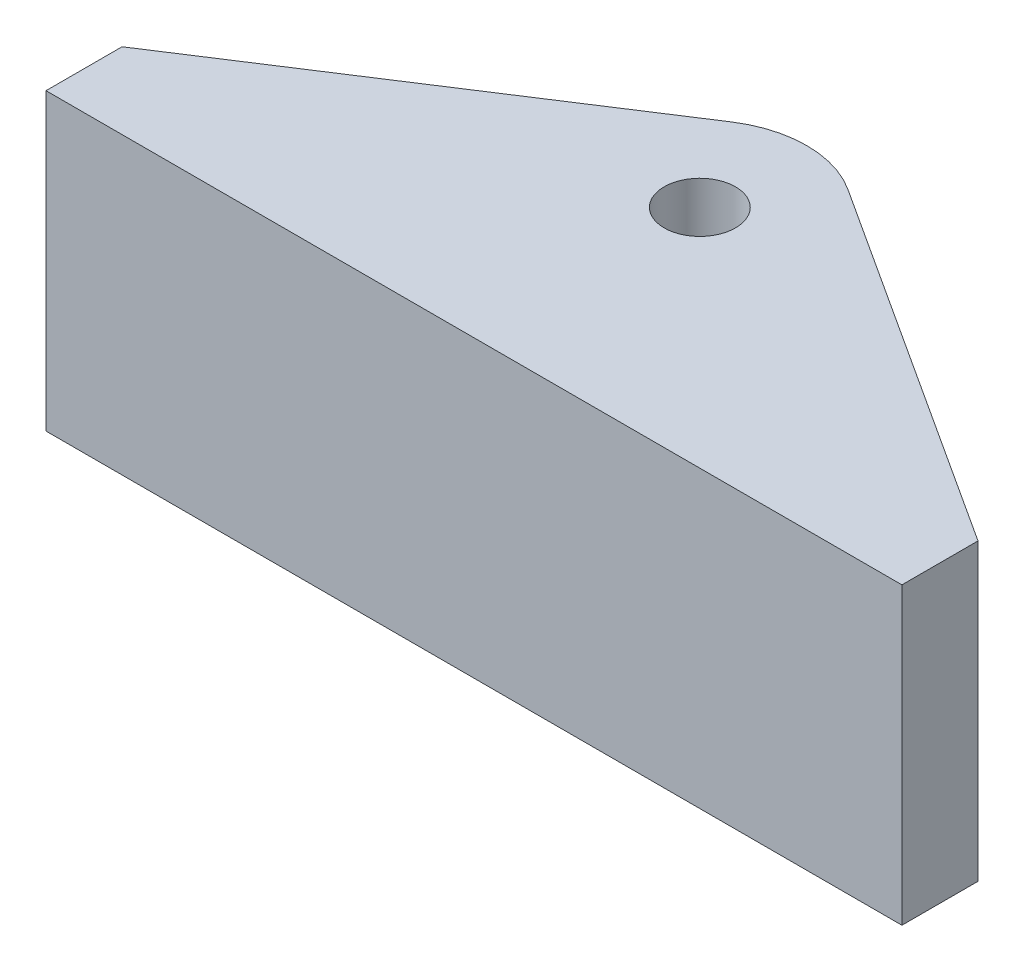
ISO-10303-21;
HEADER;
FILE_DESCRIPTION(('STEP AP214'),'2;1');
FILE_NAME('part.step','',(''),(''),'','','');
FILE_SCHEMA(('AUTOMOTIVE_DESIGN { 1 0 10303 214 1 1 1 1 }'));
ENDSEC;
DATA;
#1=APPLICATION_CONTEXT('core data for automotive mechanical design processes');
#2=APPLICATION_PROTOCOL_DEFINITION('international standard','automotive_design',2000,#1);
#3=PRODUCT_CONTEXT('',#1,'mechanical');
#4=PRODUCT('Part','Part','',(#3));
#5=PRODUCT_RELATED_PRODUCT_CATEGORY('part','',(#4));
#6=PRODUCT_DEFINITION_FORMATION('','',#4);
#7=PRODUCT_DEFINITION_CONTEXT('part definition',#1,'design');
#8=PRODUCT_DEFINITION('design','',#6,#7);
#9=PRODUCT_DEFINITION_SHAPE('','',#8);
#10=(LENGTH_UNIT() NAMED_UNIT(*) SI_UNIT(.MILLI.,.METRE.));
#11=(NAMED_UNIT(*) PLANE_ANGLE_UNIT() SI_UNIT($,.RADIAN.));
#12=(NAMED_UNIT(*) SI_UNIT($,.STERADIAN.) SOLID_ANGLE_UNIT());
#13=UNCERTAINTY_MEASURE_WITH_UNIT(LENGTH_MEASURE(1.E-05),#10,'distance_accuracy_value','');
#14=(GEOMETRIC_REPRESENTATION_CONTEXT(3) GLOBAL_UNCERTAINTY_ASSIGNED_CONTEXT((#13)) GLOBAL_UNIT_ASSIGNED_CONTEXT((#10,
#11,#12)) REPRESENTATION_CONTEXT('',''));
#15=CARTESIAN_POINT('',(0.,0.,0.));
#16=DIRECTION('',(0.,0.,1.));
#17=DIRECTION('',(1.,0.,0.));
#18=AXIS2_PLACEMENT_3D('',#15,#16,#17);
#19=CARTESIAN_POINT('',(0.,-19.685,0.));
#20=DIRECTION('',(-1.,0.,0.));
#21=DIRECTION('',(0.,0.,1.));
#22=AXIS2_PLACEMENT_3D('',#19,#20,#21);
#23=PLANE('',#22);
#24=DIRECTION('',(0.,0.,1.));
#25=VECTOR('',#24,1.);
#26=CARTESIAN_POINT('',(0.,0.,0.));
#27=LINE('',#26,#25);
#28=CARTESIAN_POINT('',(0.,0.,-5.08));
#29=VERTEX_POINT('',#28);
#30=CARTESIAN_POINT('',(0.,0.,0.));
#31=VERTEX_POINT('',#30);
#32=EDGE_CURVE('E136',#29,#31,#27,.T.);
#33=ORIENTED_EDGE('',*,*,#32,.F.);
#34=DIRECTION('',(0.,1.,0.));
#35=VECTOR('',#34,1.);
#36=CARTESIAN_POINT('',(0.,-19.685,-5.08));
#37=LINE('',#36,#35);
#38=CARTESIAN_POINT('',(0.,-19.685,-5.08));
#39=VERTEX_POINT('',#38);
#40=EDGE_CURVE('E11',#39,#29,#37,.T.);
#41=ORIENTED_EDGE('',*,*,#40,.F.);
#42=DIRECTION('',(0.,0.,1.));
#43=VECTOR('',#42,1.);
#44=CARTESIAN_POINT('',(0.,-19.685,0.));
#45=LINE('',#44,#43);
#46=CARTESIAN_POINT('',(0.,-19.685,0.));
#47=VERTEX_POINT('',#46);
#48=EDGE_CURVE('E157',#39,#47,#45,.T.);
#49=ORIENTED_EDGE('',*,*,#48,.T.);
#50=DIRECTION('',(0.,1.,0.));
#51=VECTOR('',#50,1.);
#52=CARTESIAN_POINT('',(0.,-19.685,0.));
#53=LINE('',#52,#51);
#54=EDGE_CURVE('E48',#47,#31,#53,.T.);
#55=ORIENTED_EDGE('',*,*,#54,.T.);
#56=EDGE_LOOP('',(#33,#41,#49,#55));
#57=FACE_BOUND('',#56,.T.);
#58=ADVANCED_FACE('F45',(#57),#23,.T.);
#59=CARTESIAN_POINT('',(0.,-19.685,-5.08));
#60=DIRECTION('',(-0.543739024440574,0.,-0.839254355544499));
#61=DIRECTION('',(-0.839254355544499,0.,0.543739024440574));
#62=AXIS2_PLACEMENT_3D('',#59,#60,#61);
#63=PLANE('',#62);
#64=DIRECTION('',(-0.839254355544499,0.,0.543739024440574));
#65=VECTOR('',#64,1.);
#66=CARTESIAN_POINT('',(0.,0.,-5.08));
#67=LINE('',#66,#65);
#68=CARTESIAN_POINT('',(24.6906643441527,0.,-21.076673302421));
#69=VERTEX_POINT('',#68);
#70=EDGE_CURVE('E154',#69,#29,#67,.T.);
#71=ORIENTED_EDGE('',*,*,#70,.F.);
#72=DIRECTION('',(0.,1.,0.));
#73=VECTOR('',#72,1.);
#74=CARTESIAN_POINT('',(24.6906643441527,-19.685,-21.076673302421));
#75=LINE('',#74,#73);
#76=CARTESIAN_POINT('',(24.6906643441527,-19.685,-21.076673302421));
#77=VERTEX_POINT('',#76);
#78=EDGE_CURVE('E55',#77,#69,#75,.T.);
#79=ORIENTED_EDGE('',*,*,#78,.F.);
#80=DIRECTION('',(-0.839254355544499,0.,0.543739024440574));
#81=VECTOR('',#80,1.);
#82=CARTESIAN_POINT('',(0.,-19.685,-5.08));
#83=LINE('',#82,#81);
#84=EDGE_CURVE('E122',#77,#39,#83,.T.);
#85=ORIENTED_EDGE('',*,*,#84,.T.);
#86=ORIENTED_EDGE('',*,*,#40,.T.);
#87=EDGE_LOOP('',(#71,#79,#85,#86));
#88=FACE_BOUND('',#87,.T.);
#89=ADVANCED_FACE('F169',(#88),#63,.T.);
#90=CARTESIAN_POINT('',(28.575,-19.685,-15.08125));
#91=DIRECTION('',(0.,1.,0.));
#92=DIRECTION('',(0.,0.,1.));
#93=AXIS2_PLACEMENT_3D('',#90,#91,#92);
#94=CYLINDRICAL_SURFACE('',#93,7.14375);
#95=CARTESIAN_POINT('',(28.575,0.,-15.08125));
#96=DIRECTION('',(0.,1.,0.));
#97=DIRECTION('',(0.,0.,1.));
#98=AXIS2_PLACEMENT_3D('',#95,#96,#97);
#99=CIRCLE('',#98,7.14375);
#100=CARTESIAN_POINT('',(32.4593356558474,0.,-21.076673302421));
#101=VERTEX_POINT('',#100);
#102=EDGE_CURVE('E108',#101,#69,#99,.T.);
#103=ORIENTED_EDGE('',*,*,#102,.F.);
#104=DIRECTION('',(0.,1.,0.));
#105=VECTOR('',#104,1.);
#106=CARTESIAN_POINT('',(32.4593356558474,-19.685,-21.076673302421));
#107=LINE('',#106,#105);
#108=CARTESIAN_POINT('',(32.4593356558474,-19.685,-21.076673302421));
#109=VERTEX_POINT('',#108);
#110=EDGE_CURVE('E103',#109,#101,#107,.T.);
#111=ORIENTED_EDGE('',*,*,#110,.F.);
#112=CARTESIAN_POINT('',(28.575,-19.685,-15.08125));
#113=DIRECTION('',(0.,1.,0.));
#114=DIRECTION('',(0.,0.,1.));
#115=AXIS2_PLACEMENT_3D('',#112,#113,#114);
#116=CIRCLE('',#115,7.14375);
#117=EDGE_CURVE('E106',#109,#77,#116,.T.);
#118=ORIENTED_EDGE('',*,*,#117,.T.);
#119=ORIENTED_EDGE('',*,*,#78,.T.);
#120=EDGE_LOOP('',(#103,#111,#118,#119));
#121=FACE_BOUND('',#120,.T.);
#122=ADVANCED_FACE('F105',(#121),#94,.T.);
#123=CARTESIAN_POINT('',(57.15,-19.685,-5.08));
#124=DIRECTION('',(0.543739024440575,0.,-0.839254355544499));
#125=DIRECTION('',(-0.839254355544499,0.,-0.543739024440575));
#126=AXIS2_PLACEMENT_3D('',#123,#124,#125);
#127=PLANE('',#126);
#128=DIRECTION('',(-0.839254355544499,0.,-0.543739024440575));
#129=VECTOR('',#128,1.);
#130=CARTESIAN_POINT('',(57.15,0.,-5.08));
#131=LINE('',#130,#129);
#132=CARTESIAN_POINT('',(57.15,0.,-5.08));
#133=VERTEX_POINT('',#132);
#134=EDGE_CURVE('E149',#133,#101,#131,.T.);
#135=ORIENTED_EDGE('',*,*,#134,.F.);
#136=DIRECTION('',(0.,1.,0.));
#137=VECTOR('',#136,1.);
#138=CARTESIAN_POINT('',(57.15,-19.685,-5.08));
#139=LINE('',#138,#137);
#140=CARTESIAN_POINT('',(57.15,-19.685,-5.08));
#141=VERTEX_POINT('',#140);
#142=EDGE_CURVE('E114',#141,#133,#139,.T.);
#143=ORIENTED_EDGE('',*,*,#142,.F.);
#144=DIRECTION('',(-0.839254355544499,0.,-0.543739024440575));
#145=VECTOR('',#144,1.);
#146=CARTESIAN_POINT('',(57.15,-19.685,-5.08));
#147=LINE('',#146,#145);
#148=EDGE_CURVE('E120',#141,#109,#147,.T.);
#149=ORIENTED_EDGE('',*,*,#148,.T.);
#150=ORIENTED_EDGE('',*,*,#110,.T.);
#151=EDGE_LOOP('',(#135,#143,#149,#150));
#152=FACE_BOUND('',#151,.T.);
#153=ADVANCED_FACE('F125',(#152),#127,.T.);
#154=CARTESIAN_POINT('',(57.15,-19.685,0.));
#155=DIRECTION('',(1.,0.,0.));
#156=DIRECTION('',(0.,0.,-1.));
#157=AXIS2_PLACEMENT_3D('',#154,#155,#156);
#158=PLANE('',#157);
#159=DIRECTION('',(0.,0.,-1.));
#160=VECTOR('',#159,1.);
#161=CARTESIAN_POINT('',(57.15,0.,0.));
#162=LINE('',#161,#160);
#163=CARTESIAN_POINT('',(57.15,0.,0.));
#164=VERTEX_POINT('',#163);
#165=EDGE_CURVE('E145',#164,#133,#162,.T.);
#166=ORIENTED_EDGE('',*,*,#165,.F.);
#167=DIRECTION('',(0.,1.,0.));
#168=VECTOR('',#167,1.);
#169=CARTESIAN_POINT('',(57.15,-19.685,0.));
#170=LINE('',#169,#168);
#171=CARTESIAN_POINT('',(57.15,-19.685,0.));
#172=VERTEX_POINT('',#171);
#173=EDGE_CURVE('E162',#172,#164,#170,.T.);
#174=ORIENTED_EDGE('',*,*,#173,.F.);
#175=DIRECTION('',(0.,0.,-1.));
#176=VECTOR('',#175,1.);
#177=CARTESIAN_POINT('',(57.15,-19.685,0.));
#178=LINE('',#177,#176);
#179=EDGE_CURVE('E127',#172,#141,#178,.T.);
#180=ORIENTED_EDGE('',*,*,#179,.T.);
#181=ORIENTED_EDGE('',*,*,#142,.T.);
#182=EDGE_LOOP('',(#166,#174,#180,#181));
#183=FACE_BOUND('',#182,.T.);
#184=ADVANCED_FACE('F182',(#183),#158,.T.);
#185=CARTESIAN_POINT('',(0.,-19.685,0.));
#186=DIRECTION('',(0.,0.,1.));
#187=DIRECTION('',(1.,0.,0.));
#188=AXIS2_PLACEMENT_3D('',#185,#186,#187);
#189=PLANE('',#188);
#190=DIRECTION('',(1.,0.,0.));
#191=VECTOR('',#190,1.);
#192=CARTESIAN_POINT('',(0.,0.,0.));
#193=LINE('',#192,#191);
#194=EDGE_CURVE('E140',#31,#164,#193,.T.);
#195=ORIENTED_EDGE('',*,*,#194,.F.);
#196=ORIENTED_EDGE('',*,*,#54,.F.);
#197=DIRECTION('',(1.,0.,0.));
#198=VECTOR('',#197,1.);
#199=CARTESIAN_POINT('',(0.,-19.685,0.));
#200=LINE('',#199,#198);
#201=EDGE_CURVE('E130',#47,#172,#200,.T.);
#202=ORIENTED_EDGE('',*,*,#201,.T.);
#203=ORIENTED_EDGE('',*,*,#173,.T.);
#204=EDGE_LOOP('',(#195,#196,#202,#203));
#205=FACE_BOUND('',#204,.T.);
#206=ADVANCED_FACE('F166',(#205),#189,.T.);
#207=CARTESIAN_POINT('',(28.575,-19.685,-15.08125));
#208=DIRECTION('',(0.,1.,0.));
#209=DIRECTION('',(0.,0.,1.));
#210=AXIS2_PLACEMENT_3D('',#207,#208,#209);
#211=PLANE('',#210);
#212=CARTESIAN_POINT('',(28.575,-19.685,-15.08125));
#213=DIRECTION('',(0.,1.,0.));
#214=DIRECTION('',(0.,0.,1.));
#215=AXIS2_PLACEMENT_3D('',#212,#213,#214);
#216=CIRCLE('',#215,2.38125);
#217=CARTESIAN_POINT('',(28.575,-19.685,-12.7));
#218=VERTEX_POINT('',#217);
#219=EDGE_CURVE('E141',#218,#218,#216,.T.);
#220=ORIENTED_EDGE('',*,*,#219,.T.);
#221=EDGE_LOOP('',(#220));
#222=FACE_BOUND('',#221,.T.);
#223=ORIENTED_EDGE('',*,*,#48,.F.);
#224=ORIENTED_EDGE('',*,*,#84,.F.);
#225=ORIENTED_EDGE('',*,*,#117,.F.);
#226=ORIENTED_EDGE('',*,*,#148,.F.);
#227=ORIENTED_EDGE('',*,*,#179,.F.);
#228=ORIENTED_EDGE('',*,*,#201,.F.);
#229=EDGE_LOOP('',(#223,#224,#225,#226,#227,#228));
#230=FACE_BOUND('',#229,.T.);
#231=ADVANCED_FACE('F118',(#222,#230),#211,.F.);
#232=CARTESIAN_POINT('',(28.575,0.,-15.08125));
#233=DIRECTION('',(0.,1.,0.));
#234=DIRECTION('',(0.,0.,1.));
#235=AXIS2_PLACEMENT_3D('',#232,#233,#234);
#236=PLANE('',#235);
#237=CARTESIAN_POINT('',(28.575,0.,-15.08125));
#238=DIRECTION('',(0.,1.,0.));
#239=DIRECTION('',(0.,0.,1.));
#240=AXIS2_PLACEMENT_3D('',#237,#238,#239);
#241=CIRCLE('',#240,2.38125);
#242=CARTESIAN_POINT('',(28.575,0.,-12.7));
#243=VERTEX_POINT('',#242);
#244=EDGE_CURVE('E205',#243,#243,#241,.T.);
#245=ORIENTED_EDGE('',*,*,#244,.F.);
#246=EDGE_LOOP('',(#245));
#247=FACE_BOUND('',#246,.T.);
#248=ORIENTED_EDGE('',*,*,#32,.T.);
#249=ORIENTED_EDGE('',*,*,#194,.T.);
#250=ORIENTED_EDGE('',*,*,#165,.T.);
#251=ORIENTED_EDGE('',*,*,#134,.T.);
#252=ORIENTED_EDGE('',*,*,#102,.T.);
#253=ORIENTED_EDGE('',*,*,#70,.T.);
#254=EDGE_LOOP('',(#248,#249,#250,#251,#252,#253));
#255=FACE_BOUND('',#254,.T.);
#256=ADVANCED_FACE('F168',(#247,#255),#236,.T.);
#257=CARTESIAN_POINT('',(28.575,-19.685,-15.08125));
#258=DIRECTION('',(0.,1.,0.));
#259=DIRECTION('',(0.,0.,1.));
#260=AXIS2_PLACEMENT_3D('',#257,#258,#259);
#261=CYLINDRICAL_SURFACE('',#260,2.38125);
#262=ORIENTED_EDGE('',*,*,#219,.F.);
#263=EDGE_LOOP('',(#262));
#264=FACE_BOUND('',#263,.T.);
#265=ORIENTED_EDGE('',*,*,#244,.T.);
#266=EDGE_LOOP('',(#265));
#267=FACE_BOUND('',#266,.T.);
#268=ADVANCED_FACE('F193',(#264,#267),#261,.F.);
#269=CLOSED_SHELL('',(#58,#89,#122,#153,#184,#206,#231,#256,#268));
#270=MANIFOLD_SOLID_BREP('B2',#269);
#271=ADVANCED_BREP_SHAPE_REPRESENTATION('',(#18,#270),#14);
#272=SHAPE_DEFINITION_REPRESENTATION(#9,#271);
ENDSEC;
END-ISO-10303-21;
